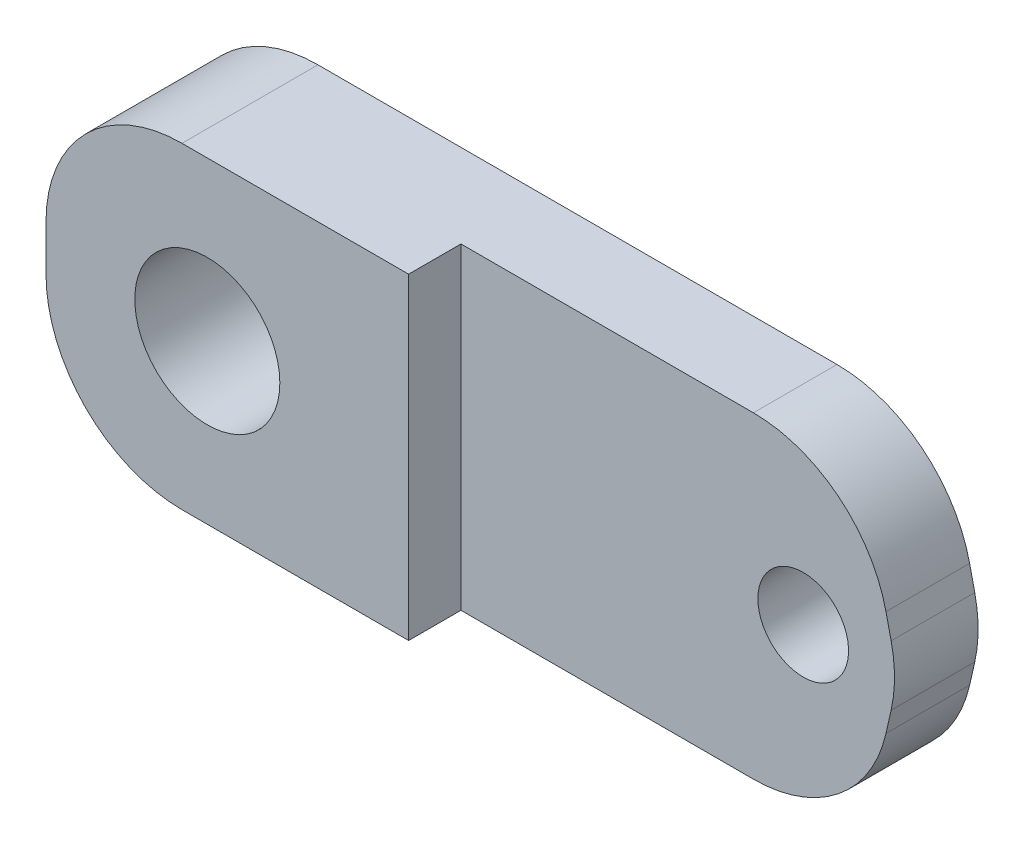
ISO-10303-21;
HEADER;
FILE_DESCRIPTION(('STEP AP214'),'2;1');
FILE_NAME('part.step','',(''),(''),'','','');
FILE_SCHEMA(('AUTOMOTIVE_DESIGN { 1 0 10303 214 1 1 1 1 }'));
ENDSEC;
DATA;
#1=APPLICATION_CONTEXT('core data for automotive mechanical design processes');
#2=APPLICATION_PROTOCOL_DEFINITION('international standard','automotive_design',2000,#1);
#3=PRODUCT_CONTEXT('',#1,'mechanical');
#4=PRODUCT('Part','Part','',(#3));
#5=PRODUCT_RELATED_PRODUCT_CATEGORY('part','',(#4));
#6=PRODUCT_DEFINITION_FORMATION('','',#4);
#7=PRODUCT_DEFINITION_CONTEXT('part definition',#1,'design');
#8=PRODUCT_DEFINITION('design','',#6,#7);
#9=PRODUCT_DEFINITION_SHAPE('','',#8);
#10=(LENGTH_UNIT() NAMED_UNIT(*) SI_UNIT(.MILLI.,.METRE.));
#11=(NAMED_UNIT(*) PLANE_ANGLE_UNIT() SI_UNIT($,.RADIAN.));
#12=(NAMED_UNIT(*) SI_UNIT($,.STERADIAN.) SOLID_ANGLE_UNIT());
#13=UNCERTAINTY_MEASURE_WITH_UNIT(LENGTH_MEASURE(1.E-05),#10,'distance_accuracy_value','');
#14=(GEOMETRIC_REPRESENTATION_CONTEXT(3) GLOBAL_UNCERTAINTY_ASSIGNED_CONTEXT((#13)) GLOBAL_UNIT_ASSIGNED_CONTEXT((#10,
#11,#12)) REPRESENTATION_CONTEXT('',''));
#15=CARTESIAN_POINT('',(0.,0.,0.));
#16=DIRECTION('',(0.,0.,1.));
#17=DIRECTION('',(1.,0.,0.));
#18=AXIS2_PLACEMENT_3D('',#15,#16,#17);
#19=CARTESIAN_POINT('',(-5.0484468688712,-0.499999999999999,3.));
#20=DIRECTION('',(0.,0.,-1.));
#21=DIRECTION('',(-1.,0.,0.));
#22=AXIS2_PLACEMENT_3D('',#19,#20,#21);
#23=PLANE('',#22);
#24=CARTESIAN_POINT('',(-15.940902872777,0.,3.));
#25=DIRECTION('',(0.,0.,1.));
#26=DIRECTION('',(1.,0.,0.));
#27=AXIS2_PLACEMENT_3D('',#24,#25,#26);
#28=CIRCLE('',#27,1.6);
#29=CARTESIAN_POINT('',(-14.3409028727769,0.,3.));
#30=VERTEX_POINT('',#29);
#31=EDGE_CURVE('E191',#30,#30,#28,.T.);
#32=ORIENTED_EDGE('',*,*,#31,.F.);
#33=EDGE_LOOP('',(#32));
#34=FACE_BOUND('',#33,.T.);
#35=DIRECTION('',(0.,-1.,0.));
#36=VECTOR('',#35,1.);
#37=CARTESIAN_POINT('',(-11.5,3.5,3.));
#38=LINE('',#37,#36);
#39=CARTESIAN_POINT('',(-11.5,3.5,3.));
#40=VERTEX_POINT('',#39);
#41=CARTESIAN_POINT('',(-11.5,-3.5,3.));
#42=VERTEX_POINT('',#41);
#43=EDGE_CURVE('E60',#40,#42,#38,.T.);
#44=ORIENTED_EDGE('',*,*,#43,.F.);
#45=DIRECTION('',(-1.,0.,0.));
#46=VECTOR('',#45,1.);
#47=CARTESIAN_POINT('',(-16.5,3.5,3.));
#48=LINE('',#47,#46);
#49=CARTESIAN_POINT('',(-16.5,3.5,3.));
#50=VERTEX_POINT('',#49);
#51=EDGE_CURVE('E114',#40,#50,#48,.T.);
#52=ORIENTED_EDGE('',*,*,#51,.T.);
#53=CARTESIAN_POINT('',(-16.5,0.500000000000001,3.));
#54=DIRECTION('',(0.,0.,1.));
#55=DIRECTION('',(1.,0.,0.));
#56=AXIS2_PLACEMENT_3D('',#53,#54,#55);
#57=CIRCLE('',#56,3.);
#58=CARTESIAN_POINT('',(-19.5,0.49999999999998,3.));
#59=VERTEX_POINT('',#58);
#60=EDGE_CURVE('E201',#50,#59,#57,.T.);
#61=ORIENTED_EDGE('',*,*,#60,.T.);
#62=DIRECTION('',(0.,-1.,0.));
#63=VECTOR('',#62,1.);
#64=CARTESIAN_POINT('',(-19.5,0.499999999999979,3.));
#65=LINE('',#64,#63);
#66=CARTESIAN_POINT('',(-19.5,-0.499999999999978,3.));
#67=VERTEX_POINT('',#66);
#68=EDGE_CURVE('E205',#59,#67,#65,.T.);
#69=ORIENTED_EDGE('',*,*,#68,.T.);
#70=CARTESIAN_POINT('',(-16.5,-0.5,3.));
#71=DIRECTION('',(0.,0.,1.));
#72=DIRECTION('',(-1.,0.,0.));
#73=AXIS2_PLACEMENT_3D('',#70,#71,#72);
#74=CIRCLE('',#73,3.);
#75=CARTESIAN_POINT('',(-16.5,-3.5,3.));
#76=VERTEX_POINT('',#75);
#77=EDGE_CURVE('E69',#67,#76,#74,.T.);
#78=ORIENTED_EDGE('',*,*,#77,.T.);
#79=DIRECTION('',(1.,0.,0.));
#80=VECTOR('',#79,1.);
#81=CARTESIAN_POINT('',(-16.5,-3.5,3.));
#82=LINE('',#81,#80);
#83=EDGE_CURVE('E210',#76,#42,#82,.T.);
#84=ORIENTED_EDGE('',*,*,#83,.T.);
#85=EDGE_LOOP('',(#44,#52,#61,#69,#78,#84));
#86=FACE_BOUND('',#85,.T.);
#87=ADVANCED_FACE('F43',(#34,#86),#23,.F.);
#88=CARTESIAN_POINT('',(-5.0484468688712,-0.499999999999999,0.));
#89=DIRECTION('',(0.,0.,-1.));
#90=DIRECTION('',(-1.,0.,0.));
#91=AXIS2_PLACEMENT_3D('',#88,#89,#90);
#92=PLANE('',#91);
#93=CARTESIAN_POINT('',(-15.940902872777,0.,0.));
#94=DIRECTION('',(0.,0.,1.));
#95=DIRECTION('',(1.,0.,0.));
#96=AXIS2_PLACEMENT_3D('',#93,#94,#95);
#97=CIRCLE('',#96,1.6);
#98=CARTESIAN_POINT('',(-14.3409028727769,0.,0.));
#99=VERTEX_POINT('',#98);
#100=EDGE_CURVE('E190',#99,#99,#97,.T.);
#101=ORIENTED_EDGE('',*,*,#100,.T.);
#102=EDGE_LOOP('',(#101));
#103=FACE_BOUND('',#102,.T.);
#104=CARTESIAN_POINT('',(-5.0484468688712,-0.499999999999999,0.));
#105=DIRECTION('',(0.,0.,1.));
#106=DIRECTION('',(-1.,0.,0.));
#107=AXIS2_PLACEMENT_3D('',#104,#105,#106);
#108=CIRCLE('',#107,3.);
#109=CARTESIAN_POINT('',(-5.04844686887122,-3.5,0.));
#110=VERTEX_POINT('',#109);
#111=CARTESIAN_POINT('',(-2.12255216277698,-1.16267651901194,0.));
#112=VERTEX_POINT('',#111);
#113=EDGE_CURVE('E195',#110,#112,#108,.T.);
#114=ORIENTED_EDGE('',*,*,#113,.F.);
#115=DIRECTION('',(1.,0.,0.));
#116=VECTOR('',#115,1.);
#117=CARTESIAN_POINT('',(-16.5,-3.5,0.));
#118=LINE('',#117,#116);
#119=CARTESIAN_POINT('',(-16.5,-3.5,0.));
#120=VERTEX_POINT('',#119);
#121=EDGE_CURVE('E202',#120,#110,#118,.T.);
#122=ORIENTED_EDGE('',*,*,#121,.F.);
#123=CARTESIAN_POINT('',(-16.5,-0.5,0.));
#124=DIRECTION('',(0.,0.,1.));
#125=DIRECTION('',(-1.,0.,0.));
#126=AXIS2_PLACEMENT_3D('',#123,#124,#125);
#127=CIRCLE('',#126,3.);
#128=CARTESIAN_POINT('',(-19.5,-0.499999999999978,0.));
#129=VERTEX_POINT('',#128);
#130=EDGE_CURVE('E240',#129,#120,#127,.T.);
#131=ORIENTED_EDGE('',*,*,#130,.F.);
#132=DIRECTION('',(0.,-1.,0.));
#133=VECTOR('',#132,1.);
#134=CARTESIAN_POINT('',(-19.5,0.499999999999979,0.));
#135=LINE('',#134,#133);
#136=CARTESIAN_POINT('',(-19.5,0.49999999999998,0.));
#137=VERTEX_POINT('',#136);
#138=EDGE_CURVE('E237',#137,#129,#135,.T.);
#139=ORIENTED_EDGE('',*,*,#138,.F.);
#140=CARTESIAN_POINT('',(-16.5,0.500000000000001,0.));
#141=DIRECTION('',(0.,0.,1.));
#142=DIRECTION('',(1.,0.,0.));
#143=AXIS2_PLACEMENT_3D('',#140,#141,#142);
#144=CIRCLE('',#143,3.);
#145=CARTESIAN_POINT('',(-16.5,3.5,0.));
#146=VERTEX_POINT('',#145);
#147=EDGE_CURVE('E234',#146,#137,#144,.T.);
#148=ORIENTED_EDGE('',*,*,#147,.F.);
#149=DIRECTION('',(-1.,0.,0.));
#150=VECTOR('',#149,1.);
#151=CARTESIAN_POINT('',(-16.5,3.5,0.));
#152=LINE('',#151,#150);
#153=CARTESIAN_POINT('',(-5.04844686887122,3.5,0.));
#154=VERTEX_POINT('',#153);
#155=EDGE_CURVE('E231',#154,#146,#152,.T.);
#156=ORIENTED_EDGE('',*,*,#155,.F.);
#157=CARTESIAN_POINT('',(-5.0484468688712,0.500000000000001,0.));
#158=DIRECTION('',(0.,0.,1.));
#159=DIRECTION('',(1.,0.,0.));
#160=AXIS2_PLACEMENT_3D('',#157,#158,#159);
#161=CIRCLE('',#160,3.);
#162=CARTESIAN_POINT('',(-2.12255216277698,1.16267651901195,0.));
#163=VERTEX_POINT('',#162);
#164=EDGE_CURVE('E227',#163,#154,#161,.T.);
#165=ORIENTED_EDGE('',*,*,#164,.F.);
#166=DIRECTION('',(-0.220892173003987,0.97529823536474,0.));
#167=VECTOR('',#166,1.);
#168=CARTESIAN_POINT('',(-2.12255216277698,1.16267651901195,0.));
#169=LINE('',#168,#167);
#170=CARTESIAN_POINT('',(-2.00930876450436,0.662676519011971,0.));
#171=VERTEX_POINT('',#170);
#172=EDGE_CURVE('E223',#171,#163,#169,.T.);
#173=ORIENTED_EDGE('',*,*,#172,.F.);
#174=CARTESIAN_POINT('',(-4.93520347059858,0.,0.));
#175=DIRECTION('',(0.,0.,1.));
#176=DIRECTION('',(-1.,0.,0.));
#177=AXIS2_PLACEMENT_3D('',#174,#175,#176);
#178=CIRCLE('',#177,3.);
#179=CARTESIAN_POINT('',(-2.00930876450436,-0.662676519011972,0.));
#180=VERTEX_POINT('',#179);
#181=EDGE_CURVE('E219',#180,#171,#178,.T.);
#182=ORIENTED_EDGE('',*,*,#181,.F.);
#183=DIRECTION('',(0.220892173003987,0.97529823536474,0.));
#184=VECTOR('',#183,1.);
#185=CARTESIAN_POINT('',(-2.00930876450436,-0.662676519011972,0.));
#186=LINE('',#185,#184);
#187=EDGE_CURVE('E215',#112,#180,#186,.T.);
#188=ORIENTED_EDGE('',*,*,#187,.F.);
#189=EDGE_LOOP('',(#114,#122,#131,#139,#148,#156,#165,#173,#182,#188));
#190=FACE_BOUND('',#189,.T.);
#191=CARTESIAN_POINT('',(-3.94869661969475,0.,0.));
#192=DIRECTION('',(0.,0.,1.));
#193=DIRECTION('',(1.,0.,0.));
#194=AXIS2_PLACEMENT_3D('',#191,#192,#193);
#195=CIRCLE('',#194,1.);
#196=CARTESIAN_POINT('',(-2.94869661969475,0.,0.));
#197=VERTEX_POINT('',#196);
#198=EDGE_CURVE('E186',#197,#197,#195,.T.);
#199=ORIENTED_EDGE('',*,*,#198,.T.);
#200=EDGE_LOOP('',(#199));
#201=FACE_BOUND('',#200,.T.);
#202=ADVANCED_FACE('F285',(#103,#190,#201),#92,.T.);
#203=CARTESIAN_POINT('',(-5.0484468688712,-0.499999999999999,3.));
#204=DIRECTION('',(0.,0.,-1.));
#205=DIRECTION('',(-1.,0.,0.));
#206=AXIS2_PLACEMENT_3D('',#203,#204,#205);
#207=CYLINDRICAL_SURFACE('',#206,3.);
#208=DIRECTION('',(0.,0.,-1.));
#209=VECTOR('',#208,1.);
#210=CARTESIAN_POINT('',(-2.12255216277698,-1.16267651901194,3.));
#211=LINE('',#210,#209);
#212=CARTESIAN_POINT('',(-2.12255216277698,-1.16267651901194,1.84538324294411));
#213=VERTEX_POINT('',#212);
#214=EDGE_CURVE('E11',#213,#112,#211,.T.);
#215=ORIENTED_EDGE('',*,*,#214,.F.);
#216=CARTESIAN_POINT('',(-5.0484468688712,-0.499999999999999,1.84538324294411));
#217=DIRECTION('',(0.,0.,-1.));
#218=DIRECTION('',(-1.,0.,0.));
#219=AXIS2_PLACEMENT_3D('',#216,#217,#218);
#220=CIRCLE('',#219,3.);
#221=CARTESIAN_POINT('',(-5.04844686887122,-3.5,1.84538324294411));
#222=VERTEX_POINT('',#221);
#223=EDGE_CURVE('E183',#213,#222,#220,.T.);
#224=ORIENTED_EDGE('',*,*,#223,.T.);
#225=DIRECTION('',(0.,0.,-1.));
#226=VECTOR('',#225,1.);
#227=CARTESIAN_POINT('',(-5.04844686887122,-3.5,3.));
#228=LINE('',#227,#226);
#229=EDGE_CURVE('E108',#222,#110,#228,.T.);
#230=ORIENTED_EDGE('',*,*,#229,.T.);
#231=ORIENTED_EDGE('',*,*,#113,.T.);
#232=EDGE_LOOP('',(#215,#224,#230,#231));
#233=FACE_BOUND('',#232,.T.);
#234=ADVANCED_FACE('F45',(#233),#207,.T.);
#235=CARTESIAN_POINT('',(-2.00930876450436,-0.662676519011972,3.));
#236=DIRECTION('',(-0.97529823536474,0.220892173003987,0.));
#237=DIRECTION('',(-0.220892173003987,-0.97529823536474,0.));
#238=AXIS2_PLACEMENT_3D('',#235,#236,#237);
#239=PLANE('',#238);
#240=DIRECTION('',(0.,0.,-1.));
#241=VECTOR('',#240,1.);
#242=CARTESIAN_POINT('',(-2.00930876450436,-0.662676519011972,3.));
#243=LINE('',#242,#241);
#244=CARTESIAN_POINT('',(-2.00930876450436,-0.662676519011972,1.84538324294411));
#245=VERTEX_POINT('',#244);
#246=EDGE_CURVE('E53',#245,#180,#243,.T.);
#247=ORIENTED_EDGE('',*,*,#246,.F.);
#248=DIRECTION('',(-0.220892173003987,-0.97529823536474,0.));
#249=VECTOR('',#248,1.);
#250=CARTESIAN_POINT('',(-2.00930876450436,-0.662676519011972,1.84538324294411));
#251=LINE('',#250,#249);
#252=EDGE_CURVE('E179',#245,#213,#251,.T.);
#253=ORIENTED_EDGE('',*,*,#252,.T.);
#254=ORIENTED_EDGE('',*,*,#214,.T.);
#255=ORIENTED_EDGE('',*,*,#187,.T.);
#256=EDGE_LOOP('',(#247,#253,#254,#255));
#257=FACE_BOUND('',#256,.T.);
#258=ADVANCED_FACE('F281',(#257),#239,.F.);
#259=CARTESIAN_POINT('',(-4.93520347059858,0.,3.));
#260=DIRECTION('',(0.,0.,-1.));
#261=DIRECTION('',(-1.,0.,0.));
#262=AXIS2_PLACEMENT_3D('',#259,#260,#261);
#263=CYLINDRICAL_SURFACE('',#262,3.);
#264=DIRECTION('',(0.,0.,-1.));
#265=VECTOR('',#264,1.);
#266=CARTESIAN_POINT('',(-2.00930876450436,0.662676519011971,3.));
#267=LINE('',#266,#265);
#268=CARTESIAN_POINT('',(-2.00930876450436,0.662676519011971,1.84538324294411));
#269=VERTEX_POINT('',#268);
#270=EDGE_CURVE('E269',#269,#171,#267,.T.);
#271=ORIENTED_EDGE('',*,*,#270,.F.);
#272=CARTESIAN_POINT('',(-4.93520347059858,0.,1.84538324294411));
#273=DIRECTION('',(0.,0.,-1.));
#274=DIRECTION('',(-1.,0.,0.));
#275=AXIS2_PLACEMENT_3D('',#272,#273,#274);
#276=CIRCLE('',#275,3.);
#277=EDGE_CURVE('E175',#269,#245,#276,.T.);
#278=ORIENTED_EDGE('',*,*,#277,.T.);
#279=ORIENTED_EDGE('',*,*,#246,.T.);
#280=ORIENTED_EDGE('',*,*,#181,.T.);
#281=EDGE_LOOP('',(#271,#278,#279,#280));
#282=FACE_BOUND('',#281,.T.);
#283=ADVANCED_FACE('F276',(#282),#263,.T.);
#284=CARTESIAN_POINT('',(-2.12255216277698,1.16267651901195,3.));
#285=DIRECTION('',(-0.97529823536474,-0.220892173003987,0.));
#286=DIRECTION('',(0.220892173003987,-0.97529823536474,0.));
#287=AXIS2_PLACEMENT_3D('',#284,#285,#286);
#288=PLANE('',#287);
#289=DIRECTION('',(0.,0.,-1.));
#290=VECTOR('',#289,1.);
#291=CARTESIAN_POINT('',(-2.12255216277698,1.16267651901195,3.));
#292=LINE('',#291,#290);
#293=CARTESIAN_POINT('',(-2.12255216277698,1.16267651901195,1.84538324294411));
#294=VERTEX_POINT('',#293);
#295=EDGE_CURVE('E266',#294,#163,#292,.T.);
#296=ORIENTED_EDGE('',*,*,#295,.F.);
#297=DIRECTION('',(0.220892173003987,-0.97529823536474,0.));
#298=VECTOR('',#297,1.);
#299=CARTESIAN_POINT('',(-2.12255216277698,1.16267651901195,1.84538324294411));
#300=LINE('',#299,#298);
#301=EDGE_CURVE('E171',#294,#269,#300,.T.);
#302=ORIENTED_EDGE('',*,*,#301,.T.);
#303=ORIENTED_EDGE('',*,*,#270,.T.);
#304=ORIENTED_EDGE('',*,*,#172,.T.);
#305=EDGE_LOOP('',(#296,#302,#303,#304));
#306=FACE_BOUND('',#305,.T.);
#307=ADVANCED_FACE('F291',(#306),#288,.F.);
#308=CARTESIAN_POINT('',(-5.0484468688712,0.500000000000001,3.));
#309=DIRECTION('',(0.,0.,-1.));
#310=DIRECTION('',(-1.,0.,0.));
#311=AXIS2_PLACEMENT_3D('',#308,#309,#310);
#312=CYLINDRICAL_SURFACE('',#311,3.);
#313=DIRECTION('',(0.,0.,-1.));
#314=VECTOR('',#313,1.);
#315=CARTESIAN_POINT('',(-5.04844686887122,3.5,3.));
#316=LINE('',#315,#314);
#317=CARTESIAN_POINT('',(-5.04844686887122,3.5,1.84538324294411));
#318=VERTEX_POINT('',#317);
#319=EDGE_CURVE('E263',#318,#154,#316,.T.);
#320=ORIENTED_EDGE('',*,*,#319,.F.);
#321=CARTESIAN_POINT('',(-5.0484468688712,0.500000000000001,1.84538324294411));
#322=DIRECTION('',(0.,0.,-1.));
#323=DIRECTION('',(-1.,0.,0.));
#324=AXIS2_PLACEMENT_3D('',#321,#322,#323);
#325=CIRCLE('',#324,3.);
#326=EDGE_CURVE('E167',#318,#294,#325,.T.);
#327=ORIENTED_EDGE('',*,*,#326,.T.);
#328=ORIENTED_EDGE('',*,*,#295,.T.);
#329=ORIENTED_EDGE('',*,*,#164,.T.);
#330=EDGE_LOOP('',(#320,#327,#328,#329));
#331=FACE_BOUND('',#330,.T.);
#332=ADVANCED_FACE('F294',(#331),#312,.T.);
#333=CARTESIAN_POINT('',(-16.5,3.5,3.));
#334=DIRECTION('',(0.,-1.,0.));
#335=DIRECTION('',(0.,0.,-1.));
#336=AXIS2_PLACEMENT_3D('',#333,#334,#335);
#337=PLANE('',#336);
#338=DIRECTION('',(0.,0.,1.));
#339=VECTOR('',#338,1.);
#340=CARTESIAN_POINT('',(-11.5,3.5,3.));
#341=LINE('',#340,#339);
#342=CARTESIAN_POINT('',(-11.5,3.5,1.84538324294411));
#343=VERTEX_POINT('',#342);
#344=EDGE_CURVE('E151',#343,#40,#341,.T.);
#345=ORIENTED_EDGE('',*,*,#344,.F.);
#346=DIRECTION('',(1.,0.,0.));
#347=VECTOR('',#346,1.);
#348=CARTESIAN_POINT('',(-11.5,3.5,1.84538324294411));
#349=LINE('',#348,#347);
#350=EDGE_CURVE('E148',#343,#318,#349,.T.);
#351=ORIENTED_EDGE('',*,*,#350,.T.);
#352=ORIENTED_EDGE('',*,*,#319,.T.);
#353=ORIENTED_EDGE('',*,*,#155,.T.);
#354=DIRECTION('',(0.,0.,-1.));
#355=VECTOR('',#354,1.);
#356=CARTESIAN_POINT('',(-16.5,3.5,3.));
#357=LINE('',#356,#355);
#358=EDGE_CURVE('E259',#50,#146,#357,.T.);
#359=ORIENTED_EDGE('',*,*,#358,.F.);
#360=ORIENTED_EDGE('',*,*,#51,.F.);
#361=EDGE_LOOP('',(#345,#351,#352,#353,#359,#360));
#362=FACE_BOUND('',#361,.T.);
#363=ADVANCED_FACE('F296',(#362),#337,.F.);
#364=CARTESIAN_POINT('',(-16.5,0.500000000000001,3.));
#365=DIRECTION('',(0.,0.,-1.));
#366=DIRECTION('',(-1.,0.,0.));
#367=AXIS2_PLACEMENT_3D('',#364,#365,#366);
#368=CYLINDRICAL_SURFACE('',#367,3.);
#369=ORIENTED_EDGE('',*,*,#147,.T.);
#370=DIRECTION('',(0.,0.,-1.));
#371=VECTOR('',#370,1.);
#372=CARTESIAN_POINT('',(-19.5,0.49999999999998,3.));
#373=LINE('',#372,#371);
#374=EDGE_CURVE('E255',#59,#137,#373,.T.);
#375=ORIENTED_EDGE('',*,*,#374,.F.);
#376=ORIENTED_EDGE('',*,*,#60,.F.);
#377=ORIENTED_EDGE('',*,*,#358,.T.);
#378=EDGE_LOOP('',(#369,#375,#376,#377));
#379=FACE_BOUND('',#378,.T.);
#380=ADVANCED_FACE('F328',(#379),#368,.T.);
#381=CARTESIAN_POINT('',(-19.5,0.499999999999979,3.));
#382=DIRECTION('',(1.,0.,0.));
#383=DIRECTION('',(0.,0.,-1.));
#384=AXIS2_PLACEMENT_3D('',#381,#382,#383);
#385=PLANE('',#384);
#386=ORIENTED_EDGE('',*,*,#138,.T.);
#387=DIRECTION('',(0.,0.,-1.));
#388=VECTOR('',#387,1.);
#389=CARTESIAN_POINT('',(-19.5,-0.499999999999978,3.));
#390=LINE('',#389,#388);
#391=EDGE_CURVE('E251',#67,#129,#390,.T.);
#392=ORIENTED_EDGE('',*,*,#391,.F.);
#393=ORIENTED_EDGE('',*,*,#68,.F.);
#394=ORIENTED_EDGE('',*,*,#374,.T.);
#395=EDGE_LOOP('',(#386,#392,#393,#394));
#396=FACE_BOUND('',#395,.T.);
#397=ADVANCED_FACE('F325',(#396),#385,.F.);
#398=CARTESIAN_POINT('',(-16.5,-0.5,3.));
#399=DIRECTION('',(0.,0.,-1.));
#400=DIRECTION('',(-1.,0.,0.));
#401=AXIS2_PLACEMENT_3D('',#398,#399,#400);
#402=CYLINDRICAL_SURFACE('',#401,3.);
#403=ORIENTED_EDGE('',*,*,#130,.T.);
#404=DIRECTION('',(0.,0.,-1.));
#405=VECTOR('',#404,1.);
#406=CARTESIAN_POINT('',(-16.5,-3.5,3.));
#407=LINE('',#406,#405);
#408=EDGE_CURVE('E247',#76,#120,#407,.T.);
#409=ORIENTED_EDGE('',*,*,#408,.F.);
#410=ORIENTED_EDGE('',*,*,#77,.F.);
#411=ORIENTED_EDGE('',*,*,#391,.T.);
#412=EDGE_LOOP('',(#403,#409,#410,#411));
#413=FACE_BOUND('',#412,.T.);
#414=ADVANCED_FACE('F322',(#413),#402,.T.);
#415=CARTESIAN_POINT('',(-16.5,-3.5,3.));
#416=DIRECTION('',(0.,1.,0.));
#417=DIRECTION('',(0.,0.,1.));
#418=AXIS2_PLACEMENT_3D('',#415,#416,#417);
#419=PLANE('',#418);
#420=ORIENTED_EDGE('',*,*,#229,.F.);
#421=DIRECTION('',(1.,0.,0.));
#422=VECTOR('',#421,1.);
#423=CARTESIAN_POINT('',(-11.5,-3.5,1.84538324294411));
#424=LINE('',#423,#422);
#425=CARTESIAN_POINT('',(-11.5,-3.5,1.84538324294411));
#426=VERTEX_POINT('',#425);
#427=EDGE_CURVE('E146',#426,#222,#424,.T.);
#428=ORIENTED_EDGE('',*,*,#427,.F.);
#429=DIRECTION('',(0.,0.,-1.));
#430=VECTOR('',#429,1.);
#431=CARTESIAN_POINT('',(-11.5,-3.5,3.));
#432=LINE('',#431,#430);
#433=EDGE_CURVE('E152',#42,#426,#432,.T.);
#434=ORIENTED_EDGE('',*,*,#433,.F.);
#435=ORIENTED_EDGE('',*,*,#83,.F.);
#436=ORIENTED_EDGE('',*,*,#408,.T.);
#437=ORIENTED_EDGE('',*,*,#121,.T.);
#438=EDGE_LOOP('',(#420,#428,#434,#435,#436,#437));
#439=FACE_BOUND('',#438,.T.);
#440=ADVANCED_FACE('F159',(#439),#419,.F.);
#441=CARTESIAN_POINT('',(-15.940902872777,0.,3.));
#442=DIRECTION('',(0.,0.,-1.));
#443=DIRECTION('',(-1.,0.,0.));
#444=AXIS2_PLACEMENT_3D('',#441,#442,#443);
#445=CYLINDRICAL_SURFACE('',#444,1.6);
#446=ORIENTED_EDGE('',*,*,#31,.T.);
#447=EDGE_LOOP('',(#446));
#448=FACE_BOUND('',#447,.T.);
#449=ORIENTED_EDGE('',*,*,#100,.F.);
#450=EDGE_LOOP('',(#449));
#451=FACE_BOUND('',#450,.T.);
#452=ADVANCED_FACE('F317',(#448,#451),#445,.F.);
#453=CARTESIAN_POINT('',(-3.94869661969475,0.,3.));
#454=DIRECTION('',(0.,0.,-1.));
#455=DIRECTION('',(-1.,0.,0.));
#456=AXIS2_PLACEMENT_3D('',#453,#454,#455);
#457=CYLINDRICAL_SURFACE('',#456,1.);
#458=CARTESIAN_POINT('',(-3.94869661969475,0.,1.84538324294411));
#459=DIRECTION('',(0.,0.,-1.));
#460=DIRECTION('',(-1.,0.,0.));
#461=AXIS2_PLACEMENT_3D('',#458,#459,#460);
#462=CIRCLE('',#461,1.);
#463=CARTESIAN_POINT('',(-4.94869661969475,0.,1.84538324294411));
#464=VERTEX_POINT('',#463);
#465=EDGE_CURVE('E47',#464,#464,#462,.T.);
#466=ORIENTED_EDGE('',*,*,#465,.F.);
#467=EDGE_LOOP('',(#466));
#468=FACE_BOUND('',#467,.T.);
#469=ORIENTED_EDGE('',*,*,#198,.F.);
#470=EDGE_LOOP('',(#469));
#471=FACE_BOUND('',#470,.T.);
#472=ADVANCED_FACE('F380',(#468,#471),#457,.F.);
#473=CARTESIAN_POINT('',(-11.5,3.5,1.84538324294411));
#474=DIRECTION('',(0.,0.,-1.));
#475=DIRECTION('',(-1.,0.,0.));
#476=AXIS2_PLACEMENT_3D('',#473,#474,#475);
#477=PLANE('',#476);
#478=ORIENTED_EDGE('',*,*,#465,.T.);
#479=EDGE_LOOP('',(#478));
#480=FACE_BOUND('',#479,.T.);
#481=ORIENTED_EDGE('',*,*,#252,.F.);
#482=ORIENTED_EDGE('',*,*,#277,.F.);
#483=ORIENTED_EDGE('',*,*,#301,.F.);
#484=ORIENTED_EDGE('',*,*,#326,.F.);
#485=ORIENTED_EDGE('',*,*,#350,.F.);
#486=DIRECTION('',(0.,1.,0.));
#487=VECTOR('',#486,1.);
#488=CARTESIAN_POINT('',(-11.5,3.5,1.84538324294411));
#489=LINE('',#488,#487);
#490=EDGE_CURVE('E143',#426,#343,#489,.T.);
#491=ORIENTED_EDGE('',*,*,#490,.F.);
#492=ORIENTED_EDGE('',*,*,#427,.T.);
#493=ORIENTED_EDGE('',*,*,#223,.F.);
#494=EDGE_LOOP('',(#481,#482,#483,#484,#485,#491,#492,#493));
#495=FACE_BOUND('',#494,.T.);
#496=ADVANCED_FACE('F144',(#480,#495),#477,.F.);
#497=CARTESIAN_POINT('',(-11.5,0.,0.));
#498=DIRECTION('',(1.,0.,0.));
#499=DIRECTION('',(0.,0.,-1.));
#500=AXIS2_PLACEMENT_3D('',#497,#498,#499);
#501=PLANE('',#500);
#502=ORIENTED_EDGE('',*,*,#43,.T.);
#503=ORIENTED_EDGE('',*,*,#433,.T.);
#504=ORIENTED_EDGE('',*,*,#490,.T.);
#505=ORIENTED_EDGE('',*,*,#344,.T.);
#506=EDGE_LOOP('',(#502,#503,#504,#505));
#507=FACE_BOUND('',#506,.T.);
#508=ADVANCED_FACE('F154',(#507),#501,.T.);
#509=CLOSED_SHELL('',(#87,#202,#234,#258,#283,#307,#332,#363,#380,#397,#414,#440,#452,#472,#496,#508));
#510=MANIFOLD_SOLID_BREP('B2',#509);
#511=ADVANCED_BREP_SHAPE_REPRESENTATION('',(#18,#510),#14);
#512=SHAPE_DEFINITION_REPRESENTATION(#9,#511);
ENDSEC;
END-ISO-10303-21;
